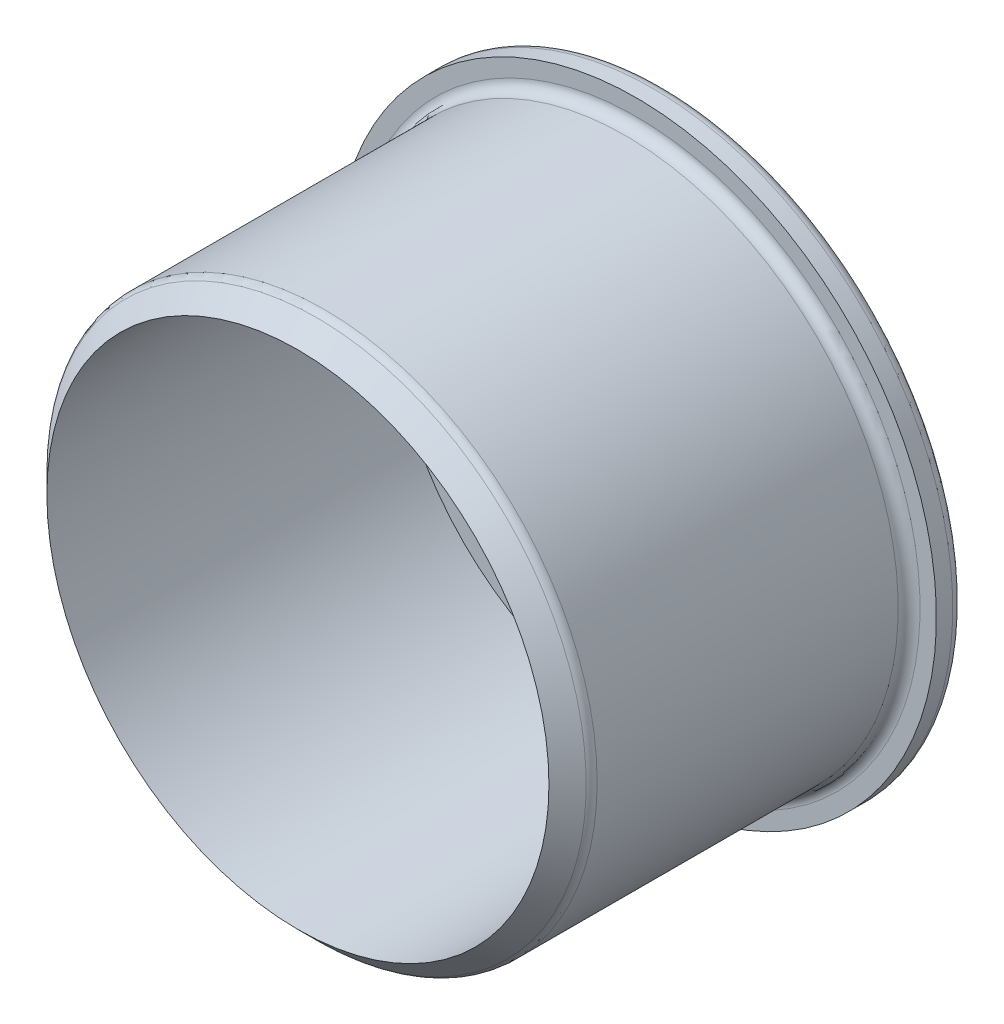
ISO-10303-21;
HEADER;
FILE_DESCRIPTION(('STEP AP214'),'2;1');
FILE_NAME('part.step','',(''),(''),'','','');
FILE_SCHEMA(('AUTOMOTIVE_DESIGN { 1 0 10303 214 1 1 1 1 }'));
ENDSEC;
DATA;
#1=APPLICATION_CONTEXT('core data for automotive mechanical design processes');
#2=APPLICATION_PROTOCOL_DEFINITION('international standard','automotive_design',2000,#1);
#3=PRODUCT_CONTEXT('',#1,'mechanical');
#4=PRODUCT('Part','Part','',(#3));
#5=PRODUCT_RELATED_PRODUCT_CATEGORY('part','',(#4));
#6=PRODUCT_DEFINITION_FORMATION('','',#4);
#7=PRODUCT_DEFINITION_CONTEXT('part definition',#1,'design');
#8=PRODUCT_DEFINITION('design','',#6,#7);
#9=PRODUCT_DEFINITION_SHAPE('','',#8);
#10=(LENGTH_UNIT() NAMED_UNIT(*) SI_UNIT(.MILLI.,.METRE.));
#11=(NAMED_UNIT(*) PLANE_ANGLE_UNIT() SI_UNIT($,.RADIAN.));
#12=(NAMED_UNIT(*) SI_UNIT($,.STERADIAN.) SOLID_ANGLE_UNIT());
#13=UNCERTAINTY_MEASURE_WITH_UNIT(LENGTH_MEASURE(1.E-05),#10,'distance_accuracy_value','');
#14=(GEOMETRIC_REPRESENTATION_CONTEXT(3) GLOBAL_UNCERTAINTY_ASSIGNED_CONTEXT((#13)) GLOBAL_UNIT_ASSIGNED_CONTEXT((#10,
#11,#12)) REPRESENTATION_CONTEXT('',''));
#15=CARTESIAN_POINT('',(0.,0.,0.));
#16=DIRECTION('',(0.,0.,1.));
#17=DIRECTION('',(1.,0.,0.));
#18=AXIS2_PLACEMENT_3D('',#15,#16,#17);
#19=CARTESIAN_POINT('',(0.,0.,32.));
#20=DIRECTION('',(0.,0.,-1.));
#21=DIRECTION('',(-1.,0.,0.));
#22=AXIS2_PLACEMENT_3D('',#19,#20,#21);
#23=CYLINDRICAL_SURFACE('',#22,25.);
#24=CARTESIAN_POINT('',(0.,0.,1.));
#25=DIRECTION('',(0.,0.,-1.));
#26=DIRECTION('',(-1.,0.,0.));
#27=AXIS2_PLACEMENT_3D('',#24,#25,#26);
#28=CIRCLE('',#27,25.);
#29=CARTESIAN_POINT('',(-25.,0.,1.));
#30=VERTEX_POINT('',#29);
#31=EDGE_CURVE('E59',#30,#30,#28,.F.);
#32=ORIENTED_EDGE('',*,*,#31,.T.);
#33=EDGE_LOOP('',(#32));
#34=FACE_BOUND('',#33,.T.);
#35=CARTESIAN_POINT('',(0.,0.,28.5857864376269));
#36=DIRECTION('',(0.,0.,1.));
#37=DIRECTION('',(1.,0.,0.));
#38=AXIS2_PLACEMENT_3D('',#35,#36,#37);
#39=CIRCLE('',#38,25.);
#40=CARTESIAN_POINT('',(25.,0.,28.5857864376269));
#41=VERTEX_POINT('',#40);
#42=EDGE_CURVE('E65',#41,#41,#39,.F.);
#43=ORIENTED_EDGE('',*,*,#42,.T.);
#44=EDGE_LOOP('',(#43));
#45=FACE_BOUND('',#44,.T.);
#46=ADVANCED_FACE('F42',(#34,#45),#23,.T.);
#47=CARTESIAN_POINT('',(0.,0.,-2.5));
#48=DIRECTION('',(0.,0.,1.));
#49=DIRECTION('',(1.,0.,0.));
#50=AXIS2_PLACEMENT_3D('',#47,#48,#49);
#51=CYLINDRICAL_SURFACE('',#50,27.5);
#52=CARTESIAN_POINT('',(0.,0.,-1.5));
#53=DIRECTION('',(0.,0.,-1.));
#54=DIRECTION('',(-1.,0.,0.));
#55=AXIS2_PLACEMENT_3D('',#52,#53,#54);
#56=CIRCLE('',#55,27.5);
#57=CARTESIAN_POINT('',(-27.5,0.,-1.5));
#58=VERTEX_POINT('',#57);
#59=EDGE_CURVE('E10',#58,#58,#56,.F.);
#60=ORIENTED_EDGE('',*,*,#59,.T.);
#61=EDGE_LOOP('',(#60));
#62=FACE_BOUND('',#61,.T.);
#63=CARTESIAN_POINT('',(0.,0.,0.));
#64=DIRECTION('',(0.,0.,-1.));
#65=DIRECTION('',(-1.,0.,0.));
#66=AXIS2_PLACEMENT_3D('',#63,#64,#65);
#67=CIRCLE('',#66,27.5);
#68=CARTESIAN_POINT('',(-27.5,0.,0.));
#69=VERTEX_POINT('',#68);
#70=EDGE_CURVE('E71',#69,#69,#67,.T.);
#71=ORIENTED_EDGE('',*,*,#70,.T.);
#72=EDGE_LOOP('',(#71));
#73=FACE_BOUND('',#72,.T.);
#74=ADVANCED_FACE('F106',(#62,#73),#51,.T.);
#75=CARTESIAN_POINT('',(0.,0.,-2.5));
#76=DIRECTION('',(0.,0.,-1.));
#77=DIRECTION('',(-1.,0.,0.));
#78=AXIS2_PLACEMENT_3D('',#75,#76,#77);
#79=PLANE('',#78);
#80=CARTESIAN_POINT('',(0.,0.,-2.5));
#81=DIRECTION('',(0.,0.,-1.));
#82=DIRECTION('',(-1.,0.,0.));
#83=AXIS2_PLACEMENT_3D('',#80,#81,#82);
#84=CIRCLE('',#83,7.);
#85=CARTESIAN_POINT('',(-7.,0.,-2.5));
#86=VERTEX_POINT('',#85);
#87=EDGE_CURVE('E77',#86,#86,#84,.T.);
#88=ORIENTED_EDGE('',*,*,#87,.F.);
#89=EDGE_LOOP('',(#88));
#90=FACE_BOUND('',#89,.T.);
#91=CARTESIAN_POINT('',(0.,0.,-2.5));
#92=DIRECTION('',(0.,0.,-1.));
#93=DIRECTION('',(-1.,0.,0.));
#94=AXIS2_PLACEMENT_3D('',#91,#92,#93);
#95=CIRCLE('',#94,26.5);
#96=CARTESIAN_POINT('',(-26.5,0.,-2.5));
#97=VERTEX_POINT('',#96);
#98=EDGE_CURVE('E50',#97,#97,#95,.T.);
#99=ORIENTED_EDGE('',*,*,#98,.T.);
#100=EDGE_LOOP('',(#99));
#101=FACE_BOUND('',#100,.T.);
#102=ADVANCED_FACE('F101',(#90,#101),#79,.T.);
#103=CARTESIAN_POINT('',(0.,0.,0.));
#104=DIRECTION('',(0.,0.,-1.));
#105=DIRECTION('',(-1.,0.,0.));
#106=AXIS2_PLACEMENT_3D('',#103,#104,#105);
#107=PLANE('',#106);
#108=CARTESIAN_POINT('',(0.,0.,0.));
#109=DIRECTION('',(0.,0.,-1.));
#110=DIRECTION('',(-1.,0.,0.));
#111=AXIS2_PLACEMENT_3D('',#108,#109,#110);
#112=CIRCLE('',#111,26.);
#113=CARTESIAN_POINT('',(-26.,0.,0.));
#114=VERTEX_POINT('',#113);
#115=EDGE_CURVE('E54',#114,#114,#112,.T.);
#116=ORIENTED_EDGE('',*,*,#115,.T.);
#117=EDGE_LOOP('',(#116));
#118=FACE_BOUND('',#117,.T.);
#119=ORIENTED_EDGE('',*,*,#70,.F.);
#120=EDGE_LOOP('',(#119));
#121=FACE_BOUND('',#120,.T.);
#122=ADVANCED_FACE('F95',(#118,#121),#107,.F.);
#123=CARTESIAN_POINT('',(0.,0.,-0.500000000000021));
#124=DIRECTION('',(0.,0.,1.));
#125=DIRECTION('',(1.,0.,0.));
#126=AXIS2_PLACEMENT_3D('',#123,#124,#125);
#127=CYLINDRICAL_SURFACE('',#126,23.);
#128=CARTESIAN_POINT('',(0.,0.,31.));
#129=DIRECTION('',(0.,0.,-1.));
#130=DIRECTION('',(-1.,0.,0.));
#131=AXIS2_PLACEMENT_3D('',#128,#129,#130);
#132=CIRCLE('',#131,23.);
#133=CARTESIAN_POINT('',(-23.,0.,31.));
#134=VERTEX_POINT('',#133);
#135=EDGE_CURVE('E68',#134,#134,#132,.F.);
#136=ORIENTED_EDGE('',*,*,#135,.T.);
#137=EDGE_LOOP('',(#136));
#138=FACE_BOUND('',#137,.T.);
#139=CARTESIAN_POINT('',(0.,0.,-0.500000000000021));
#140=DIRECTION('',(0.,0.,1.));
#141=DIRECTION('',(1.,0.,0.));
#142=AXIS2_PLACEMENT_3D('',#139,#140,#141);
#143=CIRCLE('',#142,23.);
#144=CARTESIAN_POINT('',(23.,0.,-0.500000000000021));
#145=VERTEX_POINT('',#144);
#146=EDGE_CURVE('E74',#145,#145,#143,.T.);
#147=ORIENTED_EDGE('',*,*,#146,.F.);
#148=EDGE_LOOP('',(#147));
#149=FACE_BOUND('',#148,.T.);
#150=ADVANCED_FACE('F90',(#138,#149),#127,.F.);
#151=CARTESIAN_POINT('',(0.,0.,-0.500000000000021));
#152=DIRECTION('',(0.,0.,1.));
#153=DIRECTION('',(1.,0.,0.));
#154=AXIS2_PLACEMENT_3D('',#151,#152,#153);
#155=PLANE('',#154);
#156=CARTESIAN_POINT('',(0.,0.,-0.500000000000021));
#157=DIRECTION('',(0.,0.,1.));
#158=DIRECTION('',(1.,0.,0.));
#159=AXIS2_PLACEMENT_3D('',#156,#157,#158);
#160=CIRCLE('',#159,7.);
#161=CARTESIAN_POINT('',(7.,0.,-0.500000000000021));
#162=VERTEX_POINT('',#161);
#163=EDGE_CURVE('E46',#162,#162,#160,.T.);
#164=ORIENTED_EDGE('',*,*,#163,.F.);
#165=EDGE_LOOP('',(#164));
#166=FACE_BOUND('',#165,.T.);
#167=ORIENTED_EDGE('',*,*,#146,.T.);
#168=EDGE_LOOP('',(#167));
#169=FACE_BOUND('',#168,.T.);
#170=ADVANCED_FACE('F86',(#166,#169),#155,.T.);
#171=CARTESIAN_POINT('',(0.,0.,32.));
#172=DIRECTION('',(0.,0.,-1.));
#173=DIRECTION('',(-1.,0.,0.));
#174=AXIS2_PLACEMENT_3D('',#171,#172,#173);
#175=CONICAL_SURFACE('',#174,22.,0.785398163397453);
#176=CARTESIAN_POINT('',(0.,0.,29.2928932188134));
#177=DIRECTION('',(0.,0.,-1.));
#178=DIRECTION('',(-1.,0.,0.));
#179=AXIS2_PLACEMENT_3D('',#176,#177,#178);
#180=CIRCLE('',#179,24.7071067811866);
#181=CARTESIAN_POINT('',(-24.7071067811866,0.,29.2928932188134));
#182=VERTEX_POINT('',#181);
#183=EDGE_CURVE('E62',#182,#182,#180,.F.);
#184=ORIENTED_EDGE('',*,*,#183,.T.);
#185=EDGE_LOOP('',(#184));
#186=FACE_BOUND('',#185,.T.);
#187=ORIENTED_EDGE('',*,*,#135,.F.);
#188=EDGE_LOOP('',(#187));
#189=FACE_BOUND('',#188,.T.);
#190=ADVANCED_FACE('F89',(#186,#189),#175,.T.);
#191=CARTESIAN_POINT('',(0.,0.,28.5857864376269));
#192=DIRECTION('',(0.,0.,1.));
#193=DIRECTION('',(1.,0.,0.));
#194=AXIS2_PLACEMENT_3D('',#191,#192,#193);
#195=TOROIDAL_SURFACE('',#194,24.,1.);
#196=ORIENTED_EDGE('',*,*,#183,.F.);
#197=EDGE_LOOP('',(#196));
#198=FACE_BOUND('',#197,.T.);
#199=ORIENTED_EDGE('',*,*,#42,.F.);
#200=EDGE_LOOP('',(#199));
#201=FACE_BOUND('',#200,.T.);
#202=ADVANCED_FACE('F120',(#198,#201),#195,.T.);
#203=CARTESIAN_POINT('',(0.,0.,1.));
#204=DIRECTION('',(0.,0.,-1.));
#205=DIRECTION('',(-1.,0.,0.));
#206=AXIS2_PLACEMENT_3D('',#203,#204,#205);
#207=TOROIDAL_SURFACE('',#206,26.,1.);
#208=ORIENTED_EDGE('',*,*,#115,.F.);
#209=EDGE_LOOP('',(#208));
#210=FACE_BOUND('',#209,.T.);
#211=ORIENTED_EDGE('',*,*,#31,.F.);
#212=EDGE_LOOP('',(#211));
#213=FACE_BOUND('',#212,.T.);
#214=ADVANCED_FACE('F123',(#210,#213),#207,.F.);
#215=CARTESIAN_POINT('',(0.,0.,-1.5));
#216=DIRECTION('',(0.,0.,-1.));
#217=DIRECTION('',(-1.,0.,0.));
#218=AXIS2_PLACEMENT_3D('',#215,#216,#217);
#219=TOROIDAL_SURFACE('',#218,26.5,1.);
#220=ORIENTED_EDGE('',*,*,#59,.F.);
#221=EDGE_LOOP('',(#220));
#222=FACE_BOUND('',#221,.T.);
#223=ORIENTED_EDGE('',*,*,#98,.F.);
#224=EDGE_LOOP('',(#223));
#225=FACE_BOUND('',#224,.T.);
#226=ADVANCED_FACE('F44',(#222,#225),#219,.T.);
#227=CARTESIAN_POINT('',(0.,0.,7.5));
#228=DIRECTION('',(0.,0.,-1.));
#229=DIRECTION('',(-1.,0.,0.));
#230=AXIS2_PLACEMENT_3D('',#227,#228,#229);
#231=CYLINDRICAL_SURFACE('',#230,7.);
#232=ORIENTED_EDGE('',*,*,#163,.T.);
#233=EDGE_LOOP('',(#232));
#234=FACE_BOUND('',#233,.T.);
#235=ORIENTED_EDGE('',*,*,#87,.T.);
#236=EDGE_LOOP('',(#235));
#237=FACE_BOUND('',#236,.T.);
#238=ADVANCED_FACE('F84',(#234,#237),#231,.F.);
#239=CLOSED_SHELL('',(#46,#74,#102,#122,#150,#170,#190,#202,#214,#226,#238));
#240=MANIFOLD_SOLID_BREP('B2',#239);
#241=ADVANCED_BREP_SHAPE_REPRESENTATION('',(#18,#240),#14);
#242=SHAPE_DEFINITION_REPRESENTATION(#9,#241);
ENDSEC;
END-ISO-10303-21;
